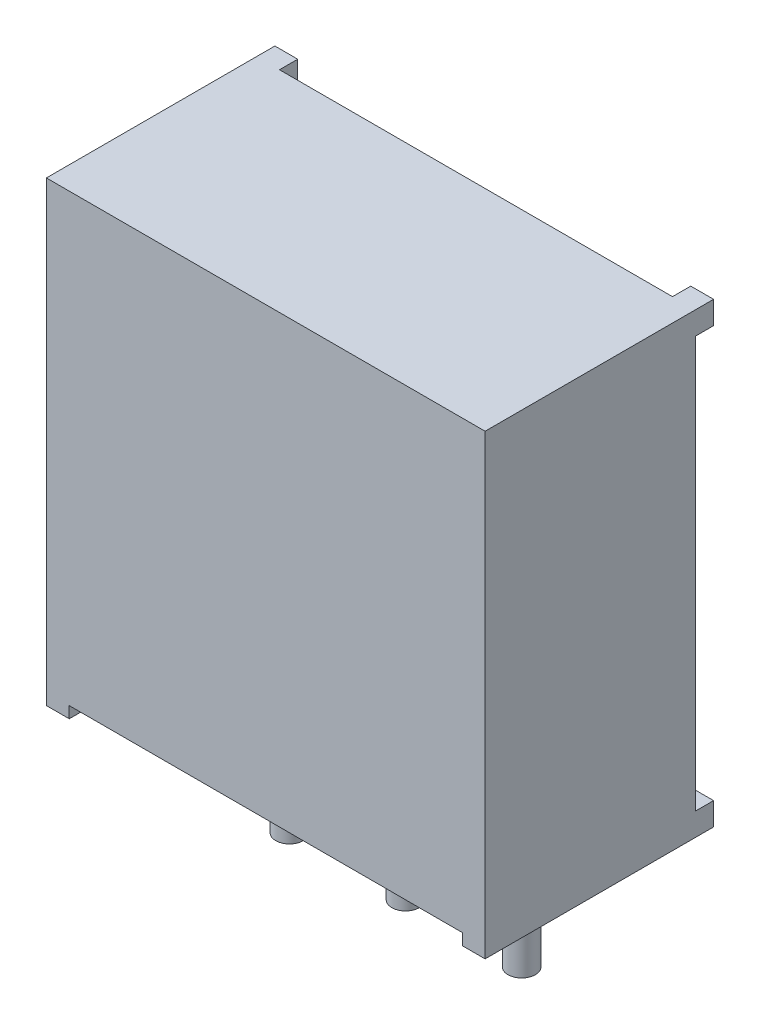
ISO-10303-21;
HEADER;
FILE_DESCRIPTION(('STEP AP214'),'2;1');
FILE_NAME('part.step','',(''),(''),'','','');
FILE_SCHEMA(('AUTOMOTIVE_DESIGN { 1 0 10303 214 1 1 1 1 }'));
ENDSEC;
DATA;
#1=APPLICATION_CONTEXT('core data for automotive mechanical design processes');
#2=APPLICATION_PROTOCOL_DEFINITION('international standard','automotive_design',2000,#1);
#3=PRODUCT_CONTEXT('',#1,'mechanical');
#4=PRODUCT('Part','Part','',(#3));
#5=PRODUCT_RELATED_PRODUCT_CATEGORY('part','',(#4));
#6=PRODUCT_DEFINITION_FORMATION('','',#4);
#7=PRODUCT_DEFINITION_CONTEXT('part definition',#1,'design');
#8=PRODUCT_DEFINITION('design','',#6,#7);
#9=PRODUCT_DEFINITION_SHAPE('','',#8);
#10=(LENGTH_UNIT() NAMED_UNIT(*) SI_UNIT(.MILLI.,.METRE.));
#11=(NAMED_UNIT(*) PLANE_ANGLE_UNIT() SI_UNIT($,.RADIAN.));
#12=(NAMED_UNIT(*) SI_UNIT($,.STERADIAN.) SOLID_ANGLE_UNIT());
#13=UNCERTAINTY_MEASURE_WITH_UNIT(LENGTH_MEASURE(1.E-05),#10,'distance_accuracy_value','');
#14=(GEOMETRIC_REPRESENTATION_CONTEXT(3) GLOBAL_UNCERTAINTY_ASSIGNED_CONTEXT((#13)) GLOBAL_UNIT_ASSIGNED_CONTEXT((#10,
#11,#12)) REPRESENTATION_CONTEXT('',''));
#15=CARTESIAN_POINT('',(0.,0.,0.));
#16=DIRECTION('',(0.,0.,1.));
#17=DIRECTION('',(1.,0.,0.));
#18=AXIS2_PLACEMENT_3D('',#15,#16,#17);
#19=CARTESIAN_POINT('',(-2.54,-2.75,0.));
#20=DIRECTION('',(0.,-1.,0.));
#21=DIRECTION('',(0.,0.,-1.));
#22=AXIS2_PLACEMENT_3D('',#19,#20,#21);
#23=PLANE('',#22);
#24=CARTESIAN_POINT('',(-2.54,-2.75,0.));
#25=DIRECTION('',(0.,1.,0.));
#26=DIRECTION('',(0.,0.,1.));
#27=AXIS2_PLACEMENT_3D('',#24,#25,#26);
#28=CIRCLE('',#27,0.3);
#29=CARTESIAN_POINT('',(-2.54,-2.75,0.3));
#30=VERTEX_POINT('',#29);
#31=EDGE_CURVE('E20',#30,#30,#28,.T.);
#32=ORIENTED_EDGE('',*,*,#31,.F.);
#33=EDGE_LOOP('',(#32));
#34=FACE_BOUND('',#33,.T.);
#35=ADVANCED_FACE('F17',(#34),#23,.T.);
#36=CARTESIAN_POINT('',(0.,-2.75,0.));
#37=DIRECTION('',(0.,-1.,0.));
#38=DIRECTION('',(0.,0.,-1.));
#39=AXIS2_PLACEMENT_3D('',#36,#37,#38);
#40=PLANE('',#39);
#41=CARTESIAN_POINT('',(0.,-2.75,0.));
#42=DIRECTION('',(0.,1.,0.));
#43=DIRECTION('',(0.,0.,1.));
#44=AXIS2_PLACEMENT_3D('',#41,#42,#43);
#45=CIRCLE('',#44,0.3);
#46=CARTESIAN_POINT('',(0.,-2.75,0.3));
#47=VERTEX_POINT('',#46);
#48=EDGE_CURVE('E193',#47,#47,#45,.T.);
#49=ORIENTED_EDGE('',*,*,#48,.F.);
#50=EDGE_LOOP('',(#49));
#51=FACE_BOUND('',#50,.T.);
#52=ADVANCED_FACE('F368',(#51),#40,.T.);
#53=CARTESIAN_POINT('',(-5.08,-2.75,0.));
#54=DIRECTION('',(0.,-1.,0.));
#55=DIRECTION('',(0.,0.,-1.));
#56=AXIS2_PLACEMENT_3D('',#53,#54,#55);
#57=PLANE('',#56);
#58=CARTESIAN_POINT('',(-5.08,-2.75,0.));
#59=DIRECTION('',(0.,1.,0.));
#60=DIRECTION('',(0.,0.,1.));
#61=AXIS2_PLACEMENT_3D('',#58,#59,#60);
#62=CIRCLE('',#61,0.3);
#63=CARTESIAN_POINT('',(-5.08,-2.75,0.299999999999999));
#64=VERTEX_POINT('',#63);
#65=EDGE_CURVE('E190',#64,#64,#62,.T.);
#66=ORIENTED_EDGE('',*,*,#65,.F.);
#67=EDGE_LOOP('',(#66));
#68=FACE_BOUND('',#67,.T.);
#69=ADVANCED_FACE('F360',(#68),#57,.T.);
#70=CARTESIAN_POINT('',(2.2,0.,3.));
#71=DIRECTION('',(0.,-1.,0.));
#72=DIRECTION('',(0.,0.,-1.));
#73=AXIS2_PLACEMENT_3D('',#70,#71,#72);
#74=PLANE('',#73);
#75=DIRECTION('',(0.,0.,-1.));
#76=VECTOR('',#75,1.);
#77=CARTESIAN_POINT('',(-7.4,0.,-2.));
#78=LINE('',#77,#76);
#79=CARTESIAN_POINT('',(-7.4,0.,3.));
#80=VERTEX_POINT('',#79);
#81=CARTESIAN_POINT('',(-7.4,0.,-2.));
#82=VERTEX_POINT('',#81);
#83=EDGE_CURVE('E312',#80,#82,#78,.T.);
#84=ORIENTED_EDGE('',*,*,#83,.T.);
#85=DIRECTION('',(1.,0.,0.));
#86=VECTOR('',#85,1.);
#87=CARTESIAN_POINT('',(2.2,0.,-2.));
#88=LINE('',#87,#86);
#89=CARTESIAN_POINT('',(-6.9,0.,-2.));
#90=VERTEX_POINT('',#89);
#91=EDGE_CURVE('E173',#82,#90,#88,.T.);
#92=ORIENTED_EDGE('',*,*,#91,.T.);
#93=DIRECTION('',(0.,0.,-1.));
#94=VECTOR('',#93,1.);
#95=CARTESIAN_POINT('',(-6.9,0.,-1.6));
#96=LINE('',#95,#94);
#97=CARTESIAN_POINT('',(-6.9,0.,3.));
#98=VERTEX_POINT('',#97);
#99=EDGE_CURVE('E195',#98,#90,#96,.T.);
#100=ORIENTED_EDGE('',*,*,#99,.F.);
#101=DIRECTION('',(1.,0.,0.));
#102=VECTOR('',#101,1.);
#103=CARTESIAN_POINT('',(2.2,0.,3.));
#104=LINE('',#103,#102);
#105=EDGE_CURVE('E175',#98,#80,#104,.F.);
#106=ORIENTED_EDGE('',*,*,#105,.T.);
#107=EDGE_LOOP('',(#84,#92,#100,#106));
#108=FACE_BOUND('',#107,.T.);
#109=ADVANCED_FACE('F358',(#108),#74,.T.);
#110=CARTESIAN_POINT('',(2.2,10.,-2.));
#111=DIRECTION('',(0.,0.,1.));
#112=DIRECTION('',(1.,0.,0.));
#113=AXIS2_PLACEMENT_3D('',#110,#111,#112);
#114=PLANE('',#113);
#115=ORIENTED_EDGE('',*,*,#91,.F.);
#116=DIRECTION('',(0.,1.,0.));
#117=VECTOR('',#116,1.);
#118=CARTESIAN_POINT('',(-7.4,10.,-2.));
#119=LINE('',#118,#117);
#120=CARTESIAN_POINT('',(-7.4,0.5,-2.));
#121=VERTEX_POINT('',#120);
#122=EDGE_CURVE('E310',#82,#121,#119,.T.);
#123=ORIENTED_EDGE('',*,*,#122,.T.);
#124=DIRECTION('',(-1.,0.,0.));
#125=VECTOR('',#124,1.);
#126=CARTESIAN_POINT('',(-7.4,0.5,-2.));
#127=LINE('',#126,#125);
#128=CARTESIAN_POINT('',(-6.9,0.5,-2.));
#129=VERTEX_POINT('',#128);
#130=EDGE_CURVE('E156',#129,#121,#127,.T.);
#131=ORIENTED_EDGE('',*,*,#130,.F.);
#132=DIRECTION('',(0.,1.,0.));
#133=VECTOR('',#132,1.);
#134=CARTESIAN_POINT('',(-6.9,0.,-2.));
#135=LINE('',#134,#133);
#136=EDGE_CURVE('E211',#90,#129,#135,.T.);
#137=ORIENTED_EDGE('',*,*,#136,.F.);
#138=EDGE_LOOP('',(#115,#123,#131,#137));
#139=FACE_BOUND('',#138,.T.);
#140=ADVANCED_FACE('F357',(#139),#114,.F.);
#141=CARTESIAN_POINT('',(-7.4,0.5,-1.6));
#142=DIRECTION('',(0.,1.,0.));
#143=DIRECTION('',(-1.,0.,0.));
#144=AXIS2_PLACEMENT_3D('',#141,#142,#143);
#145=PLANE('',#144);
#146=DIRECTION('',(-1.,0.,0.));
#147=VECTOR('',#146,1.);
#148=CARTESIAN_POINT('',(-2.6,0.5,-1.6));
#149=LINE('',#148,#147);
#150=CARTESIAN_POINT('',(-6.9,0.5,-1.6));
#151=VERTEX_POINT('',#150);
#152=CARTESIAN_POINT('',(-7.4,0.5,-1.6));
#153=VERTEX_POINT('',#152);
#154=EDGE_CURVE('E224',#151,#153,#149,.T.);
#155=ORIENTED_EDGE('',*,*,#154,.F.);
#156=DIRECTION('',(0.,0.,-1.));
#157=VECTOR('',#156,1.);
#158=CARTESIAN_POINT('',(-6.9,0.5,-1.6));
#159=LINE('',#158,#157);
#160=EDGE_CURVE('E209',#129,#151,#159,.F.);
#161=ORIENTED_EDGE('',*,*,#160,.F.);
#162=ORIENTED_EDGE('',*,*,#130,.T.);
#163=DIRECTION('',(0.,0.,-1.));
#164=VECTOR('',#163,1.);
#165=CARTESIAN_POINT('',(-7.4,0.5,-2.));
#166=LINE('',#165,#164);
#167=EDGE_CURVE('E307',#121,#153,#166,.F.);
#168=ORIENTED_EDGE('',*,*,#167,.T.);
#169=EDGE_LOOP('',(#155,#161,#162,#168));
#170=FACE_BOUND('',#169,.T.);
#171=ADVANCED_FACE('F354',(#170),#145,.T.);
#172=CARTESIAN_POINT('',(-7.4,9.5,-1.6));
#173=DIRECTION('',(0.,-1.,0.));
#174=DIRECTION('',(1.,0.,0.));
#175=AXIS2_PLACEMENT_3D('',#172,#173,#174);
#176=PLANE('',#175);
#177=DIRECTION('',(-1.,0.,0.));
#178=VECTOR('',#177,1.);
#179=CARTESIAN_POINT('',(-2.6,9.5,-1.6));
#180=LINE('',#179,#178);
#181=CARTESIAN_POINT('',(-7.4,9.5,-1.6));
#182=VERTEX_POINT('',#181);
#183=CARTESIAN_POINT('',(-6.9,9.5,-1.6));
#184=VERTEX_POINT('',#183);
#185=EDGE_CURVE('E222',#182,#184,#180,.F.);
#186=ORIENTED_EDGE('',*,*,#185,.F.);
#187=DIRECTION('',(0.,0.,-1.));
#188=VECTOR('',#187,1.);
#189=CARTESIAN_POINT('',(-7.4,9.5,-2.));
#190=LINE('',#189,#188);
#191=CARTESIAN_POINT('',(-7.4,9.5,-2.));
#192=VERTEX_POINT('',#191);
#193=EDGE_CURVE('E151',#182,#192,#190,.T.);
#194=ORIENTED_EDGE('',*,*,#193,.T.);
#195=DIRECTION('',(1.,0.,0.));
#196=VECTOR('',#195,1.);
#197=CARTESIAN_POINT('',(2.2,9.5,-2.));
#198=LINE('',#197,#196);
#199=CARTESIAN_POINT('',(-6.9,9.5,-2.));
#200=VERTEX_POINT('',#199);
#201=EDGE_CURVE('E145',#192,#200,#198,.T.);
#202=ORIENTED_EDGE('',*,*,#201,.T.);
#203=DIRECTION('',(0.,0.,1.));
#204=VECTOR('',#203,1.);
#205=CARTESIAN_POINT('',(-6.9,9.5,-1.6));
#206=LINE('',#205,#204);
#207=EDGE_CURVE('E148',#184,#200,#206,.F.);
#208=ORIENTED_EDGE('',*,*,#207,.F.);
#209=EDGE_LOOP('',(#186,#194,#202,#208));
#210=FACE_BOUND('',#209,.T.);
#211=ADVANCED_FACE('F147',(#210),#176,.T.);
#212=CARTESIAN_POINT('',(2.2,10.,-2.));
#213=DIRECTION('',(0.,0.,1.));
#214=DIRECTION('',(1.,0.,0.));
#215=AXIS2_PLACEMENT_3D('',#212,#213,#214);
#216=PLANE('',#215);
#217=DIRECTION('',(0.,1.,0.));
#218=VECTOR('',#217,1.);
#219=CARTESIAN_POINT('',(-7.4,10.,-2.));
#220=LINE('',#219,#218);
#221=CARTESIAN_POINT('',(-7.4,10.,-2.));
#222=VERTEX_POINT('',#221);
#223=EDGE_CURVE('E192',#192,#222,#220,.T.);
#224=ORIENTED_EDGE('',*,*,#223,.T.);
#225=DIRECTION('',(1.,0.,0.));
#226=VECTOR('',#225,1.);
#227=CARTESIAN_POINT('',(2.2,10.,-2.));
#228=LINE('',#227,#226);
#229=CARTESIAN_POINT('',(-6.9,10.,-2.));
#230=VERTEX_POINT('',#229);
#231=EDGE_CURVE('E168',#222,#230,#228,.T.);
#232=ORIENTED_EDGE('',*,*,#231,.T.);
#233=DIRECTION('',(0.,1.,0.));
#234=VECTOR('',#233,1.);
#235=CARTESIAN_POINT('',(-6.9,10.,-2.));
#236=LINE('',#235,#234);
#237=EDGE_CURVE('E155',#200,#230,#236,.T.);
#238=ORIENTED_EDGE('',*,*,#237,.F.);
#239=ORIENTED_EDGE('',*,*,#201,.F.);
#240=EDGE_LOOP('',(#224,#232,#238,#239));
#241=FACE_BOUND('',#240,.T.);
#242=ADVANCED_FACE('F166',(#241),#216,.F.);
#243=CARTESIAN_POINT('',(-6.9,10.,-1.6));
#244=DIRECTION('',(1.,0.,0.));
#245=DIRECTION('',(0.,1.,0.));
#246=AXIS2_PLACEMENT_3D('',#243,#244,#245);
#247=PLANE('',#246);
#248=DIRECTION('',(0.,1.,0.));
#249=VECTOR('',#248,1.);
#250=CARTESIAN_POINT('',(-6.9,5.,-1.6));
#251=LINE('',#250,#249);
#252=CARTESIAN_POINT('',(-6.9,10.,-1.6));
#253=VERTEX_POINT('',#252);
#254=EDGE_CURVE('E162',#184,#253,#251,.T.);
#255=ORIENTED_EDGE('',*,*,#254,.F.);
#256=ORIENTED_EDGE('',*,*,#207,.T.);
#257=ORIENTED_EDGE('',*,*,#237,.T.);
#258=DIRECTION('',(0.,0.,-1.));
#259=VECTOR('',#258,1.);
#260=CARTESIAN_POINT('',(-6.9,10.,3.));
#261=LINE('',#260,#259);
#262=EDGE_CURVE('E295',#230,#253,#261,.F.);
#263=ORIENTED_EDGE('',*,*,#262,.T.);
#264=EDGE_LOOP('',(#255,#256,#257,#263));
#265=FACE_BOUND('',#264,.T.);
#266=ADVANCED_FACE('F159',(#265),#247,.T.);
#267=CARTESIAN_POINT('',(1.7,10.,-1.6));
#268=DIRECTION('',(-1.,0.,0.));
#269=DIRECTION('',(0.,0.,1.));
#270=AXIS2_PLACEMENT_3D('',#267,#268,#269);
#271=PLANE('',#270);
#272=DIRECTION('',(0.,1.,0.));
#273=VECTOR('',#272,1.);
#274=CARTESIAN_POINT('',(1.7,5.,-1.6));
#275=LINE('',#274,#273);
#276=CARTESIAN_POINT('',(1.7,10.,-1.6));
#277=VERTEX_POINT('',#276);
#278=CARTESIAN_POINT('',(1.7,9.5,-1.6));
#279=VERTEX_POINT('',#278);
#280=EDGE_CURVE('E219',#277,#279,#275,.F.);
#281=ORIENTED_EDGE('',*,*,#280,.F.);
#282=DIRECTION('',(0.,0.,-1.));
#283=VECTOR('',#282,1.);
#284=CARTESIAN_POINT('',(1.7,10.,3.));
#285=LINE('',#284,#283);
#286=CARTESIAN_POINT('',(1.7,10.,-2.));
#287=VERTEX_POINT('',#286);
#288=EDGE_CURVE('E290',#277,#287,#285,.T.);
#289=ORIENTED_EDGE('',*,*,#288,.T.);
#290=DIRECTION('',(0.,1.,0.));
#291=VECTOR('',#290,1.);
#292=CARTESIAN_POINT('',(1.7,10.,-2.));
#293=LINE('',#292,#291);
#294=CARTESIAN_POINT('',(1.7,9.5,-2.));
#295=VERTEX_POINT('',#294);
#296=EDGE_CURVE('E139',#287,#295,#293,.F.);
#297=ORIENTED_EDGE('',*,*,#296,.T.);
#298=DIRECTION('',(0.,0.,-1.));
#299=VECTOR('',#298,1.);
#300=CARTESIAN_POINT('',(1.7,9.5,-1.6));
#301=LINE('',#300,#299);
#302=EDGE_CURVE('E238',#279,#295,#301,.T.);
#303=ORIENTED_EDGE('',*,*,#302,.F.);
#304=EDGE_LOOP('',(#281,#289,#297,#303));
#305=FACE_BOUND('',#304,.T.);
#306=ADVANCED_FACE('F350',(#305),#271,.T.);
#307=CARTESIAN_POINT('',(2.2,10.,-2.));
#308=DIRECTION('',(0.,0.,1.));
#309=DIRECTION('',(1.,0.,0.));
#310=AXIS2_PLACEMENT_3D('',#307,#308,#309);
#311=PLANE('',#310);
#312=DIRECTION('',(0.,1.,0.));
#313=VECTOR('',#312,1.);
#314=CARTESIAN_POINT('',(2.2,10.,-2.));
#315=LINE('',#314,#313);
#316=CARTESIAN_POINT('',(2.2,0.5,-2.));
#317=VERTEX_POINT('',#316);
#318=CARTESIAN_POINT('',(2.2,0.,-2.));
#319=VERTEX_POINT('',#318);
#320=EDGE_CURVE('E287',#317,#319,#315,.F.);
#321=ORIENTED_EDGE('',*,*,#320,.T.);
#322=DIRECTION('',(1.,0.,0.));
#323=VECTOR('',#322,1.);
#324=CARTESIAN_POINT('',(2.2,0.,-2.));
#325=LINE('',#324,#323);
#326=CARTESIAN_POINT('',(1.7,0.,-2.));
#327=VERTEX_POINT('',#326);
#328=EDGE_CURVE('E243',#327,#319,#325,.T.);
#329=ORIENTED_EDGE('',*,*,#328,.F.);
#330=DIRECTION('',(0.,1.,0.));
#331=VECTOR('',#330,1.);
#332=CARTESIAN_POINT('',(1.7,0.,-2.));
#333=LINE('',#332,#331);
#334=CARTESIAN_POINT('',(1.7,0.5,-2.));
#335=VERTEX_POINT('',#334);
#336=EDGE_CURVE('E234',#335,#327,#333,.F.);
#337=ORIENTED_EDGE('',*,*,#336,.F.);
#338=DIRECTION('',(1.,0.,0.));
#339=VECTOR('',#338,1.);
#340=CARTESIAN_POINT('',(2.2,0.5,-2.));
#341=LINE('',#340,#339);
#342=EDGE_CURVE('E236',#317,#335,#341,.F.);
#343=ORIENTED_EDGE('',*,*,#342,.F.);
#344=EDGE_LOOP('',(#321,#329,#337,#343));
#345=FACE_BOUND('',#344,.T.);
#346=ADVANCED_FACE('F341',(#345),#311,.F.);
#347=CARTESIAN_POINT('',(2.2,0.,3.));
#348=DIRECTION('',(0.,-1.,0.));
#349=DIRECTION('',(0.,0.,-1.));
#350=AXIS2_PLACEMENT_3D('',#347,#348,#349);
#351=PLANE('',#350);
#352=ORIENTED_EDGE('',*,*,#328,.T.);
#353=DIRECTION('',(0.,0.,1.));
#354=VECTOR('',#353,1.);
#355=CARTESIAN_POINT('',(2.2,0.,-2.));
#356=LINE('',#355,#354);
#357=CARTESIAN_POINT('',(2.2,0.,3.));
#358=VERTEX_POINT('',#357);
#359=EDGE_CURVE('E249',#319,#358,#356,.T.);
#360=ORIENTED_EDGE('',*,*,#359,.T.);
#361=DIRECTION('',(1.,0.,0.));
#362=VECTOR('',#361,1.);
#363=CARTESIAN_POINT('',(2.2,0.,3.));
#364=LINE('',#363,#362);
#365=CARTESIAN_POINT('',(1.7,0.,3.));
#366=VERTEX_POINT('',#365);
#367=EDGE_CURVE('E163',#358,#366,#364,.F.);
#368=ORIENTED_EDGE('',*,*,#367,.T.);
#369=DIRECTION('',(0.,0.,1.));
#370=VECTOR('',#369,1.);
#371=CARTESIAN_POINT('',(1.7,0.,-1.6));
#372=LINE('',#371,#370);
#373=EDGE_CURVE('E231',#327,#366,#372,.T.);
#374=ORIENTED_EDGE('',*,*,#373,.F.);
#375=EDGE_LOOP('',(#352,#360,#368,#374));
#376=FACE_BOUND('',#375,.T.);
#377=ADVANCED_FACE('F247',(#376),#351,.T.);
#378=CARTESIAN_POINT('',(2.2,10.,-2.));
#379=DIRECTION('',(0.,0.,1.));
#380=DIRECTION('',(1.,0.,0.));
#381=AXIS2_PLACEMENT_3D('',#378,#379,#380);
#382=PLANE('',#381);
#383=DIRECTION('',(1.,0.,0.));
#384=VECTOR('',#383,1.);
#385=CARTESIAN_POINT('',(2.2,10.,-2.));
#386=LINE('',#385,#384);
#387=CARTESIAN_POINT('',(2.2,10.,-2.));
#388=VERTEX_POINT('',#387);
#389=EDGE_CURVE('E301',#287,#388,#386,.T.);
#390=ORIENTED_EDGE('',*,*,#389,.T.);
#391=DIRECTION('',(0.,1.,0.));
#392=VECTOR('',#391,1.);
#393=CARTESIAN_POINT('',(2.2,10.,-2.));
#394=LINE('',#393,#392);
#395=CARTESIAN_POINT('',(2.2,9.5,-2.));
#396=VERTEX_POINT('',#395);
#397=EDGE_CURVE('E280',#388,#396,#394,.F.);
#398=ORIENTED_EDGE('',*,*,#397,.T.);
#399=DIRECTION('',(1.,0.,0.));
#400=VECTOR('',#399,1.);
#401=CARTESIAN_POINT('',(2.2,9.5,-2.));
#402=LINE('',#401,#400);
#403=EDGE_CURVE('E240',#295,#396,#402,.T.);
#404=ORIENTED_EDGE('',*,*,#403,.F.);
#405=ORIENTED_EDGE('',*,*,#296,.F.);
#406=EDGE_LOOP('',(#390,#398,#404,#405));
#407=FACE_BOUND('',#406,.T.);
#408=ADVANCED_FACE('F408',(#407),#382,.F.);
#409=CARTESIAN_POINT('',(2.2,9.5,-1.6));
#410=DIRECTION('',(0.,-1.,0.));
#411=DIRECTION('',(0.,0.,-1.));
#412=AXIS2_PLACEMENT_3D('',#409,#410,#411);
#413=PLANE('',#412);
#414=DIRECTION('',(-1.,0.,0.));
#415=VECTOR('',#414,1.);
#416=CARTESIAN_POINT('',(-2.6,9.5,-1.6));
#417=LINE('',#416,#415);
#418=CARTESIAN_POINT('',(2.2,9.5,-1.6));
#419=VERTEX_POINT('',#418);
#420=EDGE_CURVE('E217',#279,#419,#417,.F.);
#421=ORIENTED_EDGE('',*,*,#420,.F.);
#422=ORIENTED_EDGE('',*,*,#302,.T.);
#423=ORIENTED_EDGE('',*,*,#403,.T.);
#424=DIRECTION('',(0.,0.,1.));
#425=VECTOR('',#424,1.);
#426=CARTESIAN_POINT('',(2.2,9.5,-2.));
#427=LINE('',#426,#425);
#428=EDGE_CURVE('E277',#396,#419,#427,.T.);
#429=ORIENTED_EDGE('',*,*,#428,.T.);
#430=EDGE_LOOP('',(#421,#422,#423,#429));
#431=FACE_BOUND('',#430,.T.);
#432=ADVANCED_FACE('F405',(#431),#413,.T.);
#433=CARTESIAN_POINT('',(2.2,0.5,-1.6));
#434=DIRECTION('',(0.,1.,0.));
#435=DIRECTION('',(0.,0.,1.));
#436=AXIS2_PLACEMENT_3D('',#433,#434,#435);
#437=PLANE('',#436);
#438=DIRECTION('',(-1.,0.,0.));
#439=VECTOR('',#438,1.);
#440=CARTESIAN_POINT('',(-2.6,0.5,-1.6));
#441=LINE('',#440,#439);
#442=CARTESIAN_POINT('',(2.2,0.5,-1.6));
#443=VERTEX_POINT('',#442);
#444=CARTESIAN_POINT('',(1.7,0.5,-1.6));
#445=VERTEX_POINT('',#444);
#446=EDGE_CURVE('E215',#443,#445,#441,.T.);
#447=ORIENTED_EDGE('',*,*,#446,.F.);
#448=DIRECTION('',(0.,0.,1.));
#449=VECTOR('',#448,1.);
#450=CARTESIAN_POINT('',(2.2,0.5,-2.));
#451=LINE('',#450,#449);
#452=EDGE_CURVE('E189',#443,#317,#451,.F.);
#453=ORIENTED_EDGE('',*,*,#452,.T.);
#454=ORIENTED_EDGE('',*,*,#342,.T.);
#455=DIRECTION('',(0.,0.,1.));
#456=VECTOR('',#455,1.);
#457=CARTESIAN_POINT('',(1.7,0.5,-1.6));
#458=LINE('',#457,#456);
#459=EDGE_CURVE('E226',#445,#335,#458,.F.);
#460=ORIENTED_EDGE('',*,*,#459,.F.);
#461=EDGE_LOOP('',(#447,#453,#454,#460));
#462=FACE_BOUND('',#461,.T.);
#463=ADVANCED_FACE('F401',(#462),#437,.T.);
#464=CARTESIAN_POINT('',(-2.54,-2.75,0.));
#465=DIRECTION('',(0.,1.,0.));
#466=DIRECTION('',(0.,0.,1.));
#467=AXIS2_PLACEMENT_3D('',#464,#465,#466);
#468=CYLINDRICAL_SURFACE('',#467,0.3);
#469=ORIENTED_EDGE('',*,*,#31,.T.);
#470=EDGE_LOOP('',(#469));
#471=FACE_BOUND('',#470,.T.);
#472=CARTESIAN_POINT('',(-2.54,0.25,0.));
#473=DIRECTION('',(0.,1.,0.));
#474=DIRECTION('',(0.,0.,1.));
#475=AXIS2_PLACEMENT_3D('',#472,#473,#474);
#476=CIRCLE('',#475,0.3);
#477=CARTESIAN_POINT('',(-2.54,0.25,0.3));
#478=VERTEX_POINT('',#477);
#479=EDGE_CURVE('E185',#478,#478,#476,.F.);
#480=ORIENTED_EDGE('',*,*,#479,.T.);
#481=EDGE_LOOP('',(#480));
#482=FACE_BOUND('',#481,.T.);
#483=ADVANCED_FACE('F398',(#471,#482),#468,.T.);
#484=CARTESIAN_POINT('',(1.7,0.,-1.6));
#485=DIRECTION('',(-1.,0.,0.));
#486=DIRECTION('',(0.,0.,1.));
#487=AXIS2_PLACEMENT_3D('',#484,#485,#486);
#488=PLANE('',#487);
#489=DIRECTION('',(0.,1.,0.));
#490=VECTOR('',#489,1.);
#491=CARTESIAN_POINT('',(1.7,5.,-1.6));
#492=LINE('',#491,#490);
#493=CARTESIAN_POINT('',(1.7,0.25,-1.6));
#494=VERTEX_POINT('',#493);
#495=EDGE_CURVE('E213',#445,#494,#492,.F.);
#496=ORIENTED_EDGE('',*,*,#495,.F.);
#497=ORIENTED_EDGE('',*,*,#459,.T.);
#498=ORIENTED_EDGE('',*,*,#336,.T.);
#499=ORIENTED_EDGE('',*,*,#373,.T.);
#500=DIRECTION('',(0.,1.,0.));
#501=VECTOR('',#500,1.);
#502=CARTESIAN_POINT('',(1.7,0.,3.));
#503=LINE('',#502,#501);
#504=CARTESIAN_POINT('',(1.7,0.25,3.));
#505=VERTEX_POINT('',#504);
#506=EDGE_CURVE('E229',#366,#505,#503,.T.);
#507=ORIENTED_EDGE('',*,*,#506,.T.);
#508=DIRECTION('',(0.,0.,1.));
#509=VECTOR('',#508,1.);
#510=CARTESIAN_POINT('',(1.7,0.25,3.));
#511=LINE('',#510,#509);
#512=EDGE_CURVE('E188',#505,#494,#511,.F.);
#513=ORIENTED_EDGE('',*,*,#512,.T.);
#514=EDGE_LOOP('',(#496,#497,#498,#499,#507,#513));
#515=FACE_BOUND('',#514,.T.);
#516=ADVANCED_FACE('F255',(#515),#488,.T.);
#517=CARTESIAN_POINT('',(-2.6,5.,-1.6));
#518=DIRECTION('',(0.,0.,-1.));
#519=DIRECTION('',(-1.,0.,0.));
#520=AXIS2_PLACEMENT_3D('',#517,#518,#519);
#521=PLANE('',#520);
#522=ORIENTED_EDGE('',*,*,#446,.T.);
#523=ORIENTED_EDGE('',*,*,#495,.T.);
#524=DIRECTION('',(1.,0.,0.));
#525=VECTOR('',#524,1.);
#526=CARTESIAN_POINT('',(-6.9,0.25,-1.6));
#527=LINE('',#526,#525);
#528=CARTESIAN_POINT('',(-6.9,0.25,-1.6));
#529=VERTEX_POINT('',#528);
#530=EDGE_CURVE('E267',#494,#529,#527,.F.);
#531=ORIENTED_EDGE('',*,*,#530,.T.);
#532=DIRECTION('',(0.,1.,0.));
#533=VECTOR('',#532,1.);
#534=CARTESIAN_POINT('',(-6.9,0.,-1.6));
#535=LINE('',#534,#533);
#536=EDGE_CURVE('E203',#151,#529,#535,.F.);
#537=ORIENTED_EDGE('',*,*,#536,.F.);
#538=ORIENTED_EDGE('',*,*,#154,.T.);
#539=DIRECTION('',(0.,1.,0.));
#540=VECTOR('',#539,1.);
#541=CARTESIAN_POINT('',(-7.4,10.,-1.6));
#542=LINE('',#541,#540);
#543=EDGE_CURVE('E304',#153,#182,#542,.T.);
#544=ORIENTED_EDGE('',*,*,#543,.T.);
#545=ORIENTED_EDGE('',*,*,#185,.T.);
#546=ORIENTED_EDGE('',*,*,#254,.T.);
#547=DIRECTION('',(1.,0.,0.));
#548=VECTOR('',#547,1.);
#549=CARTESIAN_POINT('',(2.2,10.,-1.6));
#550=LINE('',#549,#548);
#551=EDGE_CURVE('E292',#253,#277,#550,.T.);
#552=ORIENTED_EDGE('',*,*,#551,.T.);
#553=ORIENTED_EDGE('',*,*,#280,.T.);
#554=ORIENTED_EDGE('',*,*,#420,.T.);
#555=DIRECTION('',(0.,1.,0.));
#556=VECTOR('',#555,1.);
#557=CARTESIAN_POINT('',(2.2,10.,-1.6));
#558=LINE('',#557,#556);
#559=EDGE_CURVE('E274',#419,#443,#558,.F.);
#560=ORIENTED_EDGE('',*,*,#559,.T.);
#561=EDGE_LOOP('',(#522,#523,#531,#537,#538,#544,#545,#546,#552,#553,#554,#560));
#562=FACE_BOUND('',#561,.T.);
#563=ADVANCED_FACE('F336',(#562),#521,.T.);
#564=CARTESIAN_POINT('',(-6.9,0.,-1.6));
#565=DIRECTION('',(1.,0.,0.));
#566=DIRECTION('',(0.,0.,-1.));
#567=AXIS2_PLACEMENT_3D('',#564,#565,#566);
#568=PLANE('',#567);
#569=DIRECTION('',(0.,1.,0.));
#570=VECTOR('',#569,1.);
#571=CARTESIAN_POINT('',(-6.9,0.,3.));
#572=LINE('',#571,#570);
#573=CARTESIAN_POINT('',(-6.9,0.25,3.));
#574=VERTEX_POINT('',#573);
#575=EDGE_CURVE('E35',#574,#98,#572,.F.);
#576=ORIENTED_EDGE('',*,*,#575,.T.);
#577=ORIENTED_EDGE('',*,*,#99,.T.);
#578=ORIENTED_EDGE('',*,*,#136,.T.);
#579=ORIENTED_EDGE('',*,*,#160,.T.);
#580=ORIENTED_EDGE('',*,*,#536,.T.);
#581=DIRECTION('',(0.,0.,1.));
#582=VECTOR('',#581,1.);
#583=CARTESIAN_POINT('',(-6.9,0.25,3.));
#584=LINE('',#583,#582);
#585=EDGE_CURVE('E184',#529,#574,#584,.T.);
#586=ORIENTED_EDGE('',*,*,#585,.T.);
#587=EDGE_LOOP('',(#576,#577,#578,#579,#580,#586));
#588=FACE_BOUND('',#587,.T.);
#589=ADVANCED_FACE('F331',(#588),#568,.T.);
#590=CARTESIAN_POINT('',(0.,-2.75,0.));
#591=DIRECTION('',(0.,1.,0.));
#592=DIRECTION('',(0.,0.,1.));
#593=AXIS2_PLACEMENT_3D('',#590,#591,#592);
#594=CYLINDRICAL_SURFACE('',#593,0.3);
#595=ORIENTED_EDGE('',*,*,#48,.T.);
#596=EDGE_LOOP('',(#595));
#597=FACE_BOUND('',#596,.T.);
#598=CARTESIAN_POINT('',(0.,0.25,0.));
#599=DIRECTION('',(0.,1.,0.));
#600=DIRECTION('',(0.,0.,1.));
#601=AXIS2_PLACEMENT_3D('',#598,#599,#600);
#602=CIRCLE('',#601,0.3);
#603=CARTESIAN_POINT('',(0.,0.25,0.3));
#604=VERTEX_POINT('',#603);
#605=EDGE_CURVE('E181',#604,#604,#602,.F.);
#606=ORIENTED_EDGE('',*,*,#605,.T.);
#607=EDGE_LOOP('',(#606));
#608=FACE_BOUND('',#607,.T.);
#609=ADVANCED_FACE('F388',(#597,#608),#594,.T.);
#610=CARTESIAN_POINT('',(-5.08,-2.75,0.));
#611=DIRECTION('',(0.,1.,0.));
#612=DIRECTION('',(0.,0.,1.));
#613=AXIS2_PLACEMENT_3D('',#610,#611,#612);
#614=CYLINDRICAL_SURFACE('',#613,0.3);
#615=ORIENTED_EDGE('',*,*,#65,.T.);
#616=EDGE_LOOP('',(#615));
#617=FACE_BOUND('',#616,.T.);
#618=CARTESIAN_POINT('',(-5.08,0.25,0.));
#619=DIRECTION('',(0.,1.,0.));
#620=DIRECTION('',(0.,0.,1.));
#621=AXIS2_PLACEMENT_3D('',#618,#619,#620);
#622=CIRCLE('',#621,0.3);
#623=CARTESIAN_POINT('',(-5.08,0.25,0.299999999999999));
#624=VERTEX_POINT('',#623);
#625=EDGE_CURVE('E177',#624,#624,#622,.F.);
#626=ORIENTED_EDGE('',*,*,#625,.T.);
#627=EDGE_LOOP('',(#626));
#628=FACE_BOUND('',#627,.T.);
#629=ADVANCED_FACE('F385',(#617,#628),#614,.T.);
#630=CARTESIAN_POINT('',(-7.4,10.,-2.));
#631=DIRECTION('',(1.,0.,0.));
#632=DIRECTION('',(0.,0.,-1.));
#633=AXIS2_PLACEMENT_3D('',#630,#631,#632);
#634=PLANE('',#633);
#635=ORIENTED_EDGE('',*,*,#543,.F.);
#636=ORIENTED_EDGE('',*,*,#167,.F.);
#637=ORIENTED_EDGE('',*,*,#122,.F.);
#638=ORIENTED_EDGE('',*,*,#83,.F.);
#639=DIRECTION('',(0.,1.,0.));
#640=VECTOR('',#639,1.);
#641=CARTESIAN_POINT('',(-7.4,10.,3.));
#642=LINE('',#641,#640);
#643=CARTESIAN_POINT('',(-7.4,10.,3.));
#644=VERTEX_POINT('',#643);
#645=EDGE_CURVE('E180',#80,#644,#642,.T.);
#646=ORIENTED_EDGE('',*,*,#645,.T.);
#647=DIRECTION('',(0.,0.,-1.));
#648=VECTOR('',#647,1.);
#649=CARTESIAN_POINT('',(-7.4,10.,3.));
#650=LINE('',#649,#648);
#651=EDGE_CURVE('E298',#644,#222,#650,.T.);
#652=ORIENTED_EDGE('',*,*,#651,.T.);
#653=ORIENTED_EDGE('',*,*,#223,.F.);
#654=ORIENTED_EDGE('',*,*,#193,.F.);
#655=EDGE_LOOP('',(#635,#636,#637,#638,#646,#652,#653,#654));
#656=FACE_BOUND('',#655,.T.);
#657=ADVANCED_FACE('F324',(#656),#634,.F.);
#658=CARTESIAN_POINT('',(2.2,10.,3.));
#659=DIRECTION('',(0.,-1.,0.));
#660=DIRECTION('',(0.,0.,-1.));
#661=AXIS2_PLACEMENT_3D('',#658,#659,#660);
#662=PLANE('',#661);
#663=ORIENTED_EDGE('',*,*,#551,.F.);
#664=ORIENTED_EDGE('',*,*,#262,.F.);
#665=ORIENTED_EDGE('',*,*,#231,.F.);
#666=ORIENTED_EDGE('',*,*,#651,.F.);
#667=DIRECTION('',(-1.,0.,0.));
#668=VECTOR('',#667,1.);
#669=CARTESIAN_POINT('',(2.2,10.,3.));
#670=LINE('',#669,#668);
#671=CARTESIAN_POINT('',(2.2,10.,3.));
#672=VERTEX_POINT('',#671);
#673=EDGE_CURVE('E327',#644,#672,#670,.F.);
#674=ORIENTED_EDGE('',*,*,#673,.T.);
#675=DIRECTION('',(0.,0.,1.));
#676=VECTOR('',#675,1.);
#677=CARTESIAN_POINT('',(2.2,10.,-2.));
#678=LINE('',#677,#676);
#679=EDGE_CURVE('E283',#672,#388,#678,.F.);
#680=ORIENTED_EDGE('',*,*,#679,.T.);
#681=ORIENTED_EDGE('',*,*,#389,.F.);
#682=ORIENTED_EDGE('',*,*,#288,.F.);
#683=EDGE_LOOP('',(#663,#664,#665,#666,#674,#680,#681,#682));
#684=FACE_BOUND('',#683,.T.);
#685=ADVANCED_FACE('F319',(#684),#662,.F.);
#686=CARTESIAN_POINT('',(2.2,10.,-2.));
#687=DIRECTION('',(-1.,0.,0.));
#688=DIRECTION('',(0.,0.,1.));
#689=AXIS2_PLACEMENT_3D('',#686,#687,#688);
#690=PLANE('',#689);
#691=ORIENTED_EDGE('',*,*,#559,.F.);
#692=ORIENTED_EDGE('',*,*,#428,.F.);
#693=ORIENTED_EDGE('',*,*,#397,.F.);
#694=ORIENTED_EDGE('',*,*,#679,.F.);
#695=DIRECTION('',(0.,1.,0.));
#696=VECTOR('',#695,1.);
#697=CARTESIAN_POINT('',(2.2,10.,3.));
#698=LINE('',#697,#696);
#699=EDGE_CURVE('E26',#672,#358,#698,.F.);
#700=ORIENTED_EDGE('',*,*,#699,.T.);
#701=ORIENTED_EDGE('',*,*,#359,.F.);
#702=ORIENTED_EDGE('',*,*,#320,.F.);
#703=ORIENTED_EDGE('',*,*,#452,.F.);
#704=EDGE_LOOP('',(#691,#692,#693,#694,#700,#701,#702,#703));
#705=FACE_BOUND('',#704,.T.);
#706=ADVANCED_FACE('F344',(#705),#690,.F.);
#707=CARTESIAN_POINT('',(-6.9,0.25,3.));
#708=DIRECTION('',(0.,1.,0.));
#709=DIRECTION('',(0.,0.,1.));
#710=AXIS2_PLACEMENT_3D('',#707,#708,#709);
#711=PLANE('',#710);
#712=ORIENTED_EDGE('',*,*,#625,.F.);
#713=EDGE_LOOP('',(#712));
#714=FACE_BOUND('',#713,.T.);
#715=ORIENTED_EDGE('',*,*,#605,.F.);
#716=EDGE_LOOP('',(#715));
#717=FACE_BOUND('',#716,.T.);
#718=ORIENTED_EDGE('',*,*,#530,.F.);
#719=ORIENTED_EDGE('',*,*,#512,.F.);
#720=DIRECTION('',(-1.,0.,0.));
#721=VECTOR('',#720,1.);
#722=CARTESIAN_POINT('',(2.2,0.25,3.));
#723=LINE('',#722,#721);
#724=EDGE_CURVE('E11',#505,#574,#723,.T.);
#725=ORIENTED_EDGE('',*,*,#724,.T.);
#726=ORIENTED_EDGE('',*,*,#585,.F.);
#727=EDGE_LOOP('',(#718,#719,#725,#726));
#728=FACE_BOUND('',#727,.T.);
#729=ORIENTED_EDGE('',*,*,#479,.F.);
#730=EDGE_LOOP('',(#729));
#731=FACE_BOUND('',#730,.T.);
#732=ADVANCED_FACE('F264',(#714,#717,#728,#731),#711,.F.);
#733=CARTESIAN_POINT('',(2.2,10.,3.));
#734=DIRECTION('',(0.,0.,-1.));
#735=DIRECTION('',(-1.,0.,0.));
#736=AXIS2_PLACEMENT_3D('',#733,#734,#735);
#737=PLANE('',#736);
#738=ORIENTED_EDGE('',*,*,#575,.F.);
#739=ORIENTED_EDGE('',*,*,#724,.F.);
#740=ORIENTED_EDGE('',*,*,#506,.F.);
#741=ORIENTED_EDGE('',*,*,#367,.F.);
#742=ORIENTED_EDGE('',*,*,#699,.F.);
#743=ORIENTED_EDGE('',*,*,#673,.F.);
#744=ORIENTED_EDGE('',*,*,#645,.F.);
#745=ORIENTED_EDGE('',*,*,#105,.F.);
#746=EDGE_LOOP('',(#738,#739,#740,#741,#742,#743,#744,#745));
#747=FACE_BOUND('',#746,.T.);
#748=ADVANCED_FACE('F260',(#747),#737,.F.);
#749=CLOSED_SHELL('',(#35,#52,#69,#109,#140,#171,#211,#242,#266,#306,#346,#377,#408,#432,#463,
#483,#516,#563,#589,#609,#629,#657,#685,#706,#732,#748));
#750=MANIFOLD_SOLID_BREP('B1',#749);
#751=ADVANCED_BREP_SHAPE_REPRESENTATION('',(#18,#750),#14);
#752=SHAPE_DEFINITION_REPRESENTATION(#9,#751);
ENDSEC;
END-ISO-10303-21;
